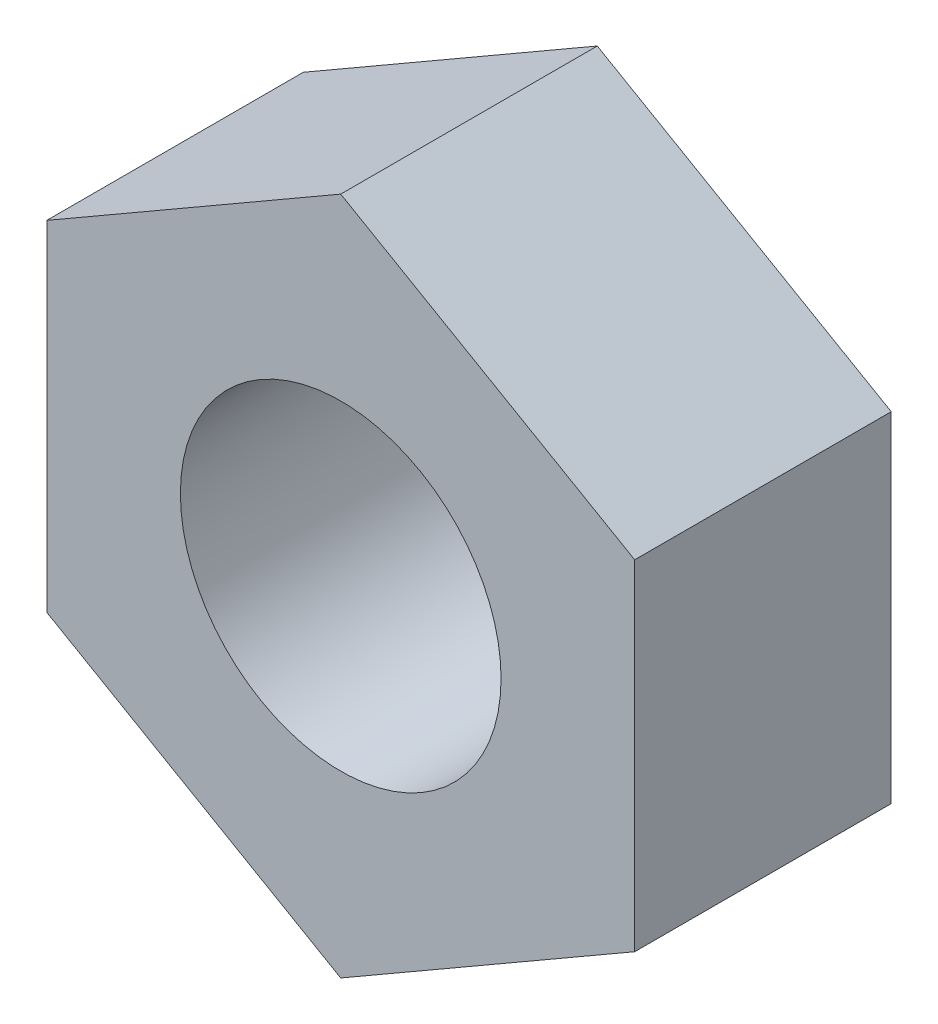
ISO-10303-21;
HEADER;
FILE_DESCRIPTION(('STEP AP214'),'2;1');
FILE_NAME('part.step','',(''),(''),'','','');
FILE_SCHEMA(('AUTOMOTIVE_DESIGN { 1 0 10303 214 1 1 1 1 }'));
ENDSEC;
DATA;
#1=APPLICATION_CONTEXT('core data for automotive mechanical design processes');
#2=APPLICATION_PROTOCOL_DEFINITION('international standard','automotive_design',2000,#1);
#3=PRODUCT_CONTEXT('',#1,'mechanical');
#4=PRODUCT('Part','Part','',(#3));
#5=PRODUCT_RELATED_PRODUCT_CATEGORY('part','',(#4));
#6=PRODUCT_DEFINITION_FORMATION('','',#4);
#7=PRODUCT_DEFINITION_CONTEXT('part definition',#1,'design');
#8=PRODUCT_DEFINITION('design','',#6,#7);
#9=PRODUCT_DEFINITION_SHAPE('','',#8);
#10=(LENGTH_UNIT() NAMED_UNIT(*) SI_UNIT(.MILLI.,.METRE.));
#11=(NAMED_UNIT(*) PLANE_ANGLE_UNIT() SI_UNIT($,.RADIAN.));
#12=(NAMED_UNIT(*) SI_UNIT($,.STERADIAN.) SOLID_ANGLE_UNIT());
#13=UNCERTAINTY_MEASURE_WITH_UNIT(LENGTH_MEASURE(1.E-05),#10,'distance_accuracy_value','');
#14=(GEOMETRIC_REPRESENTATION_CONTEXT(3) GLOBAL_UNCERTAINTY_ASSIGNED_CONTEXT((#13)) GLOBAL_UNIT_ASSIGNED_CONTEXT((#10,
#11,#12)) REPRESENTATION_CONTEXT('',''));
#15=CARTESIAN_POINT('',(0.,0.,0.));
#16=DIRECTION('',(0.,0.,1.));
#17=DIRECTION('',(1.,0.,0.));
#18=AXIS2_PLACEMENT_3D('',#15,#16,#17);
#19=CARTESIAN_POINT('',(0.,0.,2.4));
#20=DIRECTION('',(0.,0.,1.));
#21=DIRECTION('',(1.,0.,0.));
#22=AXIS2_PLACEMENT_3D('',#19,#20,#21);
#23=PLANE('',#22);
#24=DIRECTION('',(0.866025403784441,-0.499999999999995,0.));
#25=VECTOR('',#24,1.);
#26=CARTESIAN_POINT('',(-2.74999999999998,1.58771324027144,2.4));
#27=LINE('',#26,#25);
#28=CARTESIAN_POINT('',(-2.74999999999998,1.58771324027144,2.4));
#29=VERTEX_POINT('',#28);
#30=CARTESIAN_POINT('',(0.,0.,2.4));
#31=VERTEX_POINT('',#30);
#32=EDGE_CURVE('E129',#29,#31,#27,.T.);
#33=ORIENTED_EDGE('',*,*,#32,.T.);
#34=DIRECTION('',(0.866025403784438,0.500000000000001,0.));
#35=VECTOR('',#34,1.);
#36=CARTESIAN_POINT('',(0.,0.,2.4));
#37=LINE('',#36,#35);
#38=CARTESIAN_POINT('',(2.75,1.58771324027148,2.4));
#39=VERTEX_POINT('',#38);
#40=EDGE_CURVE('E87',#31,#39,#37,.T.);
#41=ORIENTED_EDGE('',*,*,#40,.T.);
#42=DIRECTION('',(0.,1.,0.));
#43=VECTOR('',#42,1.);
#44=CARTESIAN_POINT('',(2.75,1.58771324027148,2.4));
#45=LINE('',#44,#43);
#46=CARTESIAN_POINT('',(2.74999999999999,4.76313972081443,2.4));
#47=VERTEX_POINT('',#46);
#48=EDGE_CURVE('E100',#39,#47,#45,.T.);
#49=ORIENTED_EDGE('',*,*,#48,.T.);
#50=DIRECTION('',(-0.86602540378444,0.499999999999998,0.));
#51=VECTOR('',#50,1.);
#52=CARTESIAN_POINT('',(2.74999999999999,4.76313972081443,2.4));
#53=LINE('',#52,#51);
#54=CARTESIAN_POINT('',(0.,6.35085296108589,2.4));
#55=VERTEX_POINT('',#54);
#56=EDGE_CURVE('E94',#47,#55,#53,.T.);
#57=ORIENTED_EDGE('',*,*,#56,.T.);
#58=DIRECTION('',(-0.866025403784436,-0.500000000000004,0.));
#59=VECTOR('',#58,1.);
#60=CARTESIAN_POINT('',(0.,6.35085296108589,2.4));
#61=LINE('',#60,#59);
#62=CARTESIAN_POINT('',(-2.75000000000002,4.76313972081439,2.4));
#63=VERTEX_POINT('',#62);
#64=EDGE_CURVE('E98',#55,#63,#61,.T.);
#65=ORIENTED_EDGE('',*,*,#64,.T.);
#66=DIRECTION('',(0.,-1.,0.));
#67=VECTOR('',#66,1.);
#68=CARTESIAN_POINT('',(-2.75000000000002,4.76313972081439,2.4));
#69=LINE('',#68,#67);
#70=EDGE_CURVE('E50',#63,#29,#69,.T.);
#71=ORIENTED_EDGE('',*,*,#70,.T.);
#72=EDGE_LOOP('',(#33,#41,#49,#57,#65,#71));
#73=FACE_BOUND('',#72,.T.);
#74=CARTESIAN_POINT('',(0.,3.17542648054294,2.4));
#75=DIRECTION('',(0.,0.,1.));
#76=DIRECTION('',(1.,0.,0.));
#77=AXIS2_PLACEMENT_3D('',#74,#75,#76);
#78=CIRCLE('',#77,1.5);
#79=CARTESIAN_POINT('',(1.5,3.17542648054294,2.4));
#80=VERTEX_POINT('',#79);
#81=EDGE_CURVE('E122',#80,#80,#78,.T.);
#82=ORIENTED_EDGE('',*,*,#81,.F.);
#83=EDGE_LOOP('',(#82));
#84=FACE_BOUND('',#83,.T.);
#85=ADVANCED_FACE('F33',(#73,#84),#23,.T.);
#86=CARTESIAN_POINT('',(0.,0.,0.));
#87=DIRECTION('',(0.,0.,1.));
#88=DIRECTION('',(1.,0.,0.));
#89=AXIS2_PLACEMENT_3D('',#86,#87,#88);
#90=PLANE('',#89);
#91=DIRECTION('',(0.866025403784441,-0.499999999999995,0.));
#92=VECTOR('',#91,1.);
#93=CARTESIAN_POINT('',(-2.74999999999998,1.58771324027144,0.));
#94=LINE('',#93,#92);
#95=CARTESIAN_POINT('',(-2.74999999999998,1.58771324027144,0.));
#96=VERTEX_POINT('',#95);
#97=CARTESIAN_POINT('',(0.,0.,0.));
#98=VERTEX_POINT('',#97);
#99=EDGE_CURVE('E118',#96,#98,#94,.T.);
#100=ORIENTED_EDGE('',*,*,#99,.F.);
#101=DIRECTION('',(0.,-1.,0.));
#102=VECTOR('',#101,1.);
#103=CARTESIAN_POINT('',(-2.75000000000002,4.76313972081439,0.));
#104=LINE('',#103,#102);
#105=CARTESIAN_POINT('',(-2.75000000000002,4.76313972081439,0.));
#106=VERTEX_POINT('',#105);
#107=EDGE_CURVE('E79',#106,#96,#104,.T.);
#108=ORIENTED_EDGE('',*,*,#107,.F.);
#109=DIRECTION('',(-0.866025403784436,-0.500000000000004,0.));
#110=VECTOR('',#109,1.);
#111=CARTESIAN_POINT('',(0.,6.35085296108589,0.));
#112=LINE('',#111,#110);
#113=CARTESIAN_POINT('',(0.,6.35085296108589,0.));
#114=VERTEX_POINT('',#113);
#115=EDGE_CURVE('E73',#114,#106,#112,.T.);
#116=ORIENTED_EDGE('',*,*,#115,.F.);
#117=DIRECTION('',(-0.86602540378444,0.499999999999998,0.));
#118=VECTOR('',#117,1.);
#119=CARTESIAN_POINT('',(2.74999999999999,4.76313972081443,0.));
#120=LINE('',#119,#118);
#121=CARTESIAN_POINT('',(2.74999999999999,4.76313972081443,0.));
#122=VERTEX_POINT('',#121);
#123=EDGE_CURVE('E108',#122,#114,#120,.T.);
#124=ORIENTED_EDGE('',*,*,#123,.F.);
#125=DIRECTION('',(0.,1.,0.));
#126=VECTOR('',#125,1.);
#127=CARTESIAN_POINT('',(2.75,1.58771324027148,0.));
#128=LINE('',#127,#126);
#129=CARTESIAN_POINT('',(2.75,1.58771324027148,0.));
#130=VERTEX_POINT('',#129);
#131=EDGE_CURVE('E124',#130,#122,#128,.T.);
#132=ORIENTED_EDGE('',*,*,#131,.F.);
#133=DIRECTION('',(0.866025403784438,0.500000000000001,0.));
#134=VECTOR('',#133,1.);
#135=CARTESIAN_POINT('',(0.,0.,0.));
#136=LINE('',#135,#134);
#137=EDGE_CURVE('E121',#98,#130,#136,.T.);
#138=ORIENTED_EDGE('',*,*,#137,.F.);
#139=EDGE_LOOP('',(#100,#108,#116,#124,#132,#138));
#140=FACE_BOUND('',#139,.T.);
#141=CARTESIAN_POINT('',(0.,3.17542648054294,0.));
#142=DIRECTION('',(0.,0.,1.));
#143=DIRECTION('',(1.,0.,0.));
#144=AXIS2_PLACEMENT_3D('',#141,#142,#143);
#145=CIRCLE('',#144,1.5);
#146=CARTESIAN_POINT('',(1.5,3.17542648054294,0.));
#147=VERTEX_POINT('',#146);
#148=EDGE_CURVE('E222',#147,#147,#145,.T.);
#149=ORIENTED_EDGE('',*,*,#148,.T.);
#150=EDGE_LOOP('',(#149));
#151=FACE_BOUND('',#150,.T.);
#152=ADVANCED_FACE('F138',(#140,#151),#90,.F.);
#153=CARTESIAN_POINT('',(-2.74999999999998,1.58771324027144,2.4));
#154=DIRECTION('',(0.499999999999995,0.866025403784441,0.));
#155=DIRECTION('',(-0.866025403784442,0.499999999999995,0.));
#156=AXIS2_PLACEMENT_3D('',#153,#154,#155);
#157=PLANE('',#156);
#158=ORIENTED_EDGE('',*,*,#99,.T.);
#159=DIRECTION('',(0.,0.,-1.));
#160=VECTOR('',#159,1.);
#161=CARTESIAN_POINT('',(0.,0.,2.4));
#162=LINE('',#161,#160);
#163=EDGE_CURVE('E11',#31,#98,#162,.T.);
#164=ORIENTED_EDGE('',*,*,#163,.F.);
#165=ORIENTED_EDGE('',*,*,#32,.F.);
#166=DIRECTION('',(0.,0.,-1.));
#167=VECTOR('',#166,1.);
#168=CARTESIAN_POINT('',(-2.74999999999998,1.58771324027144,2.4));
#169=LINE('',#168,#167);
#170=EDGE_CURVE('E114',#29,#96,#169,.T.);
#171=ORIENTED_EDGE('',*,*,#170,.T.);
#172=EDGE_LOOP('',(#158,#164,#165,#171));
#173=FACE_BOUND('',#172,.T.);
#174=ADVANCED_FACE('F35',(#173),#157,.F.);
#175=CARTESIAN_POINT('',(0.,0.,2.4));
#176=DIRECTION('',(-0.500000000000001,0.866025403784438,0.));
#177=DIRECTION('',(-0.866025403784438,-0.500000000000001,0.));
#178=AXIS2_PLACEMENT_3D('',#175,#176,#177);
#179=PLANE('',#178);
#180=ORIENTED_EDGE('',*,*,#137,.T.);
#181=DIRECTION('',(0.,0.,-1.));
#182=VECTOR('',#181,1.);
#183=CARTESIAN_POINT('',(2.75,1.58771324027148,2.4));
#184=LINE('',#183,#182);
#185=EDGE_CURVE('E42',#39,#130,#184,.T.);
#186=ORIENTED_EDGE('',*,*,#185,.F.);
#187=ORIENTED_EDGE('',*,*,#40,.F.);
#188=ORIENTED_EDGE('',*,*,#163,.T.);
#189=EDGE_LOOP('',(#180,#186,#187,#188));
#190=FACE_BOUND('',#189,.T.);
#191=ADVANCED_FACE('F163',(#190),#179,.F.);
#192=CARTESIAN_POINT('',(2.75,1.58771324027148,2.4));
#193=DIRECTION('',(-1.,0.,0.));
#194=DIRECTION('',(0.,-1.,0.));
#195=AXIS2_PLACEMENT_3D('',#192,#193,#194);
#196=PLANE('',#195);
#197=ORIENTED_EDGE('',*,*,#131,.T.);
#198=DIRECTION('',(0.,0.,-1.));
#199=VECTOR('',#198,1.);
#200=CARTESIAN_POINT('',(2.74999999999999,4.76313972081443,2.4));
#201=LINE('',#200,#199);
#202=EDGE_CURVE('E109',#47,#122,#201,.T.);
#203=ORIENTED_EDGE('',*,*,#202,.F.);
#204=ORIENTED_EDGE('',*,*,#48,.F.);
#205=ORIENTED_EDGE('',*,*,#185,.T.);
#206=EDGE_LOOP('',(#197,#203,#204,#205));
#207=FACE_BOUND('',#206,.T.);
#208=ADVANCED_FACE('F135',(#207),#196,.F.);
#209=CARTESIAN_POINT('',(2.74999999999999,4.76313972081443,2.4));
#210=DIRECTION('',(-0.499999999999998,-0.86602540378444,0.));
#211=DIRECTION('',(0.86602540378444,-0.499999999999998,0.));
#212=AXIS2_PLACEMENT_3D('',#209,#210,#211);
#213=PLANE('',#212);
#214=ORIENTED_EDGE('',*,*,#123,.T.);
#215=DIRECTION('',(0.,0.,-1.));
#216=VECTOR('',#215,1.);
#217=CARTESIAN_POINT('',(0.,6.35085296108589,2.4));
#218=LINE('',#217,#216);
#219=EDGE_CURVE('E105',#55,#114,#218,.T.);
#220=ORIENTED_EDGE('',*,*,#219,.F.);
#221=ORIENTED_EDGE('',*,*,#56,.F.);
#222=ORIENTED_EDGE('',*,*,#202,.T.);
#223=EDGE_LOOP('',(#214,#220,#221,#222));
#224=FACE_BOUND('',#223,.T.);
#225=ADVANCED_FACE('F106',(#224),#213,.F.);
#226=CARTESIAN_POINT('',(0.,6.35085296108589,2.4));
#227=DIRECTION('',(0.500000000000004,-0.866025403784436,0.));
#228=DIRECTION('',(0.866025403784436,0.500000000000004,0.));
#229=AXIS2_PLACEMENT_3D('',#226,#227,#228);
#230=PLANE('',#229);
#231=ORIENTED_EDGE('',*,*,#115,.T.);
#232=DIRECTION('',(0.,0.,-1.));
#233=VECTOR('',#232,1.);
#234=CARTESIAN_POINT('',(-2.75000000000002,4.76313972081439,2.4));
#235=LINE('',#234,#233);
#236=EDGE_CURVE('E110',#63,#106,#235,.T.);
#237=ORIENTED_EDGE('',*,*,#236,.F.);
#238=ORIENTED_EDGE('',*,*,#64,.F.);
#239=ORIENTED_EDGE('',*,*,#219,.T.);
#240=EDGE_LOOP('',(#231,#237,#238,#239));
#241=FACE_BOUND('',#240,.T.);
#242=ADVANCED_FACE('F112',(#241),#230,.F.);
#243=CARTESIAN_POINT('',(-2.75000000000002,4.76313972081439,2.4));
#244=DIRECTION('',(1.,0.,0.));
#245=DIRECTION('',(0.,1.,0.));
#246=AXIS2_PLACEMENT_3D('',#243,#244,#245);
#247=PLANE('',#246);
#248=ORIENTED_EDGE('',*,*,#107,.T.);
#249=ORIENTED_EDGE('',*,*,#170,.F.);
#250=ORIENTED_EDGE('',*,*,#70,.F.);
#251=ORIENTED_EDGE('',*,*,#236,.T.);
#252=EDGE_LOOP('',(#248,#249,#250,#251));
#253=FACE_BOUND('',#252,.T.);
#254=ADVANCED_FACE('F143',(#253),#247,.F.);
#255=CARTESIAN_POINT('',(0.,3.17542648054294,2.4));
#256=DIRECTION('',(0.,0.,-1.));
#257=DIRECTION('',(-1.,0.,0.));
#258=AXIS2_PLACEMENT_3D('',#255,#256,#257);
#259=CYLINDRICAL_SURFACE('',#258,1.5);
#260=ORIENTED_EDGE('',*,*,#81,.T.);
#261=EDGE_LOOP('',(#260));
#262=FACE_BOUND('',#261,.T.);
#263=ORIENTED_EDGE('',*,*,#148,.F.);
#264=EDGE_LOOP('',(#263));
#265=FACE_BOUND('',#264,.T.);
#266=ADVANCED_FACE('F145',(#262,#265),#259,.F.);
#267=CLOSED_SHELL('',(#85,#152,#174,#191,#208,#225,#242,#254,#266));
#268=MANIFOLD_SOLID_BREP('B2',#267);
#269=ADVANCED_BREP_SHAPE_REPRESENTATION('',(#18,#268),#14);
#270=SHAPE_DEFINITION_REPRESENTATION(#9,#269);
ENDSEC;
END-ISO-10303-21;
